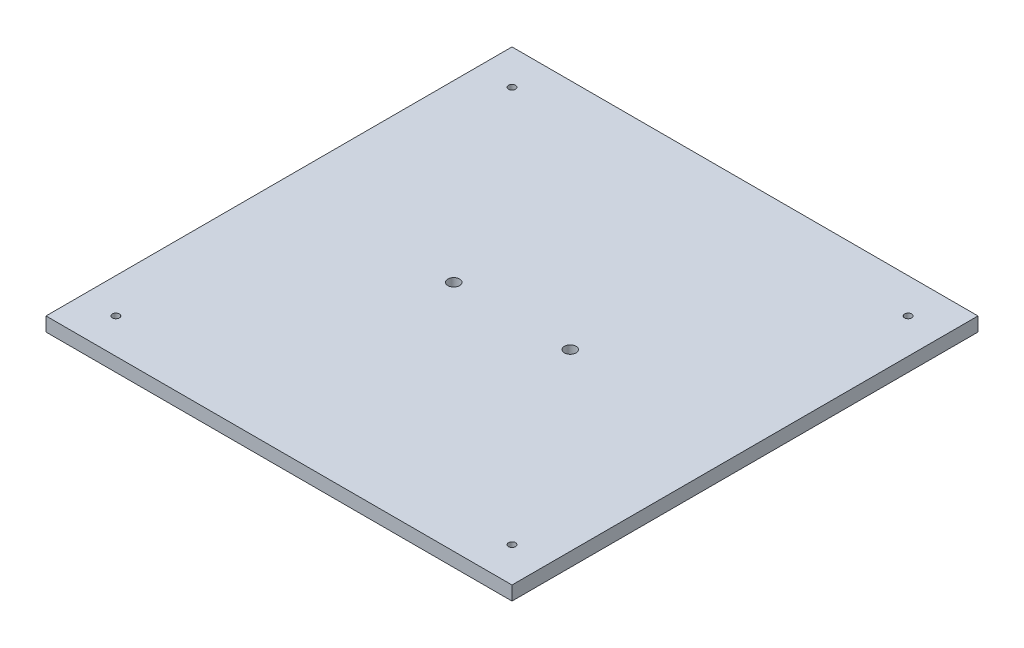
ISO-10303-21;
HEADER;
FILE_DESCRIPTION(('STEP AP214'),'2;1');
FILE_NAME('part.step','',(''),(''),'','','');
FILE_SCHEMA(('AUTOMOTIVE_DESIGN { 1 0 10303 214 1 1 1 1 }'));
ENDSEC;
DATA;
#1=APPLICATION_CONTEXT('core data for automotive mechanical design processes');
#2=APPLICATION_PROTOCOL_DEFINITION('international standard','automotive_design',2000,#1);
#3=PRODUCT_CONTEXT('',#1,'mechanical');
#4=PRODUCT('Part','Part','',(#3));
#5=PRODUCT_RELATED_PRODUCT_CATEGORY('part','',(#4));
#6=PRODUCT_DEFINITION_FORMATION('','',#4);
#7=PRODUCT_DEFINITION_CONTEXT('part definition',#1,'design');
#8=PRODUCT_DEFINITION('design','',#6,#7);
#9=PRODUCT_DEFINITION_SHAPE('','',#8);
#10=(LENGTH_UNIT() NAMED_UNIT(*) SI_UNIT(.MILLI.,.METRE.));
#11=(NAMED_UNIT(*) PLANE_ANGLE_UNIT() SI_UNIT($,.RADIAN.));
#12=(NAMED_UNIT(*) SI_UNIT($,.STERADIAN.) SOLID_ANGLE_UNIT());
#13=UNCERTAINTY_MEASURE_WITH_UNIT(LENGTH_MEASURE(1.E-05),#10,'distance_accuracy_value','');
#14=(GEOMETRIC_REPRESENTATION_CONTEXT(3) GLOBAL_UNCERTAINTY_ASSIGNED_CONTEXT((#13)) GLOBAL_UNIT_ASSIGNED_CONTEXT((#10,
#11,#12)) REPRESENTATION_CONTEXT('',''));
#15=CARTESIAN_POINT('',(0.,0.,0.));
#16=DIRECTION('',(0.,0.,1.));
#17=DIRECTION('',(1.,0.,0.));
#18=AXIS2_PLACEMENT_3D('',#15,#16,#17);
#19=CARTESIAN_POINT('',(0.,12.,0.));
#20=DIRECTION('',(0.,1.,0.));
#21=DIRECTION('',(0.,0.,1.));
#22=AXIS2_PLACEMENT_3D('',#19,#20,#21);
#23=PLANE('',#22);
#24=CARTESIAN_POINT('',(170.00000000001,12.,169.99999999999));
#25=DIRECTION('',(0.,1.,0.));
#26=DIRECTION('',(0.,0.,1.));
#27=AXIS2_PLACEMENT_3D('',#24,#25,#26);
#28=CIRCLE('',#27,2.99999999999999);
#29=CARTESIAN_POINT('',(170.00000000001,12.,172.99999999999));
#30=VERTEX_POINT('',#29);
#31=EDGE_CURVE('E133',#30,#30,#28,.T.);
#32=ORIENTED_EDGE('',*,*,#31,.F.);
#33=EDGE_LOOP('',(#32));
#34=FACE_BOUND('',#33,.T.);
#35=CARTESIAN_POINT('',(50.0000000000048,12.,-4.77395900588817E-12));
#36=DIRECTION('',(0.,1.,0.));
#37=DIRECTION('',(0.,0.,1.));
#38=AXIS2_PLACEMENT_3D('',#35,#36,#37);
#39=CIRCLE('',#38,5.);
#40=CARTESIAN_POINT('',(50.0000000000048,12.,4.99999999999522));
#41=VERTEX_POINT('',#40);
#42=EDGE_CURVE('E121',#41,#41,#39,.T.);
#43=ORIENTED_EDGE('',*,*,#42,.F.);
#44=EDGE_LOOP('',(#43));
#45=FACE_BOUND('',#44,.T.);
#46=CARTESIAN_POINT('',(-49.9999999999952,12.,-4.77395900588817E-12));
#47=DIRECTION('',(0.,1.,0.));
#48=DIRECTION('',(0.,0.,1.));
#49=AXIS2_PLACEMENT_3D('',#46,#47,#48);
#50=CIRCLE('',#49,5.);
#51=CARTESIAN_POINT('',(-49.9999999999952,12.,4.99999999999522));
#52=VERTEX_POINT('',#51);
#53=EDGE_CURVE('E100',#52,#52,#50,.T.);
#54=ORIENTED_EDGE('',*,*,#53,.F.);
#55=EDGE_LOOP('',(#54));
#56=FACE_BOUND('',#55,.T.);
#57=DIRECTION('',(0.,0.,1.));
#58=VECTOR('',#57,1.);
#59=CARTESIAN_POINT('',(-200.,12.,-200.));
#60=LINE('',#59,#58);
#61=CARTESIAN_POINT('',(-200.,12.,-200.));
#62=VERTEX_POINT('',#61);
#63=CARTESIAN_POINT('',(-200.,12.,200.));
#64=VERTEX_POINT('',#63);
#65=EDGE_CURVE('E85',#62,#64,#60,.T.);
#66=ORIENTED_EDGE('',*,*,#65,.T.);
#67=DIRECTION('',(1.,0.,0.));
#68=VECTOR('',#67,1.);
#69=CARTESIAN_POINT('',(-200.,12.,200.));
#70=LINE('',#69,#68);
#71=CARTESIAN_POINT('',(200.,12.,200.));
#72=VERTEX_POINT('',#71);
#73=EDGE_CURVE('E80',#64,#72,#70,.T.);
#74=ORIENTED_EDGE('',*,*,#73,.T.);
#75=DIRECTION('',(0.,0.,-1.));
#76=VECTOR('',#75,1.);
#77=CARTESIAN_POINT('',(200.,12.,-200.));
#78=LINE('',#77,#76);
#79=CARTESIAN_POINT('',(200.,12.,-200.));
#80=VERTEX_POINT('',#79);
#81=EDGE_CURVE('E83',#72,#80,#78,.T.);
#82=ORIENTED_EDGE('',*,*,#81,.T.);
#83=DIRECTION('',(-1.,0.,0.));
#84=VECTOR('',#83,1.);
#85=CARTESIAN_POINT('',(-200.,12.,-200.));
#86=LINE('',#85,#84);
#87=EDGE_CURVE('E50',#80,#62,#86,.T.);
#88=ORIENTED_EDGE('',*,*,#87,.T.);
#89=EDGE_LOOP('',(#66,#74,#82,#88));
#90=FACE_BOUND('',#89,.T.);
#91=CARTESIAN_POINT('',(-170.,12.,-170.));
#92=DIRECTION('',(0.,1.,0.));
#93=DIRECTION('',(0.,0.,1.));
#94=AXIS2_PLACEMENT_3D('',#91,#92,#93);
#95=CIRCLE('',#94,2.99999999999999);
#96=CARTESIAN_POINT('',(-170.,12.,-167.));
#97=VERTEX_POINT('',#96);
#98=EDGE_CURVE('E115',#97,#97,#95,.T.);
#99=ORIENTED_EDGE('',*,*,#98,.F.);
#100=EDGE_LOOP('',(#99));
#101=FACE_BOUND('',#100,.T.);
#102=CARTESIAN_POINT('',(170.,12.,-170.00000000001));
#103=DIRECTION('',(0.,1.,0.));
#104=DIRECTION('',(0.,0.,1.));
#105=AXIS2_PLACEMENT_3D('',#102,#103,#104);
#106=CIRCLE('',#105,2.99999999999999);
#107=CARTESIAN_POINT('',(170.,12.,-167.00000000001));
#108=VERTEX_POINT('',#107);
#109=EDGE_CURVE('E127',#108,#108,#106,.T.);
#110=ORIENTED_EDGE('',*,*,#109,.F.);
#111=EDGE_LOOP('',(#110));
#112=FACE_BOUND('',#111,.T.);
#113=CARTESIAN_POINT('',(-169.99999999999,12.,170.));
#114=DIRECTION('',(0.,1.,0.));
#115=DIRECTION('',(0.,0.,1.));
#116=AXIS2_PLACEMENT_3D('',#113,#114,#115);
#117=CIRCLE('',#116,2.99999999999999);
#118=CARTESIAN_POINT('',(-169.99999999999,12.,173.));
#119=VERTEX_POINT('',#118);
#120=EDGE_CURVE('E139',#119,#119,#117,.T.);
#121=ORIENTED_EDGE('',*,*,#120,.F.);
#122=EDGE_LOOP('',(#121));
#123=FACE_BOUND('',#122,.T.);
#124=ADVANCED_FACE('F33',(#34,#45,#56,#90,#101,#112,#123),#23,.T.);
#125=CARTESIAN_POINT('',(0.,0.,0.));
#126=DIRECTION('',(0.,1.,0.));
#127=DIRECTION('',(0.,0.,1.));
#128=AXIS2_PLACEMENT_3D('',#125,#126,#127);
#129=PLANE('',#128);
#130=DIRECTION('',(0.,0.,1.));
#131=VECTOR('',#130,1.);
#132=CARTESIAN_POINT('',(-200.,0.,-200.));
#133=LINE('',#132,#131);
#134=CARTESIAN_POINT('',(-200.,0.,-200.));
#135=VERTEX_POINT('',#134);
#136=CARTESIAN_POINT('',(-200.,0.,200.));
#137=VERTEX_POINT('',#136);
#138=EDGE_CURVE('E97',#135,#137,#133,.T.);
#139=ORIENTED_EDGE('',*,*,#138,.F.);
#140=DIRECTION('',(-1.,0.,0.));
#141=VECTOR('',#140,1.);
#142=CARTESIAN_POINT('',(-200.,0.,-200.));
#143=LINE('',#142,#141);
#144=CARTESIAN_POINT('',(200.,0.,-200.));
#145=VERTEX_POINT('',#144);
#146=EDGE_CURVE('E73',#145,#135,#143,.T.);
#147=ORIENTED_EDGE('',*,*,#146,.F.);
#148=DIRECTION('',(0.,0.,-1.));
#149=VECTOR('',#148,1.);
#150=CARTESIAN_POINT('',(200.,0.,-200.));
#151=LINE('',#150,#149);
#152=CARTESIAN_POINT('',(200.,0.,200.));
#153=VERTEX_POINT('',#152);
#154=EDGE_CURVE('E67',#153,#145,#151,.T.);
#155=ORIENTED_EDGE('',*,*,#154,.F.);
#156=DIRECTION('',(1.,0.,0.));
#157=VECTOR('',#156,1.);
#158=CARTESIAN_POINT('',(-200.,0.,200.));
#159=LINE('',#158,#157);
#160=EDGE_CURVE('E89',#137,#153,#159,.T.);
#161=ORIENTED_EDGE('',*,*,#160,.F.);
#162=EDGE_LOOP('',(#139,#147,#155,#161));
#163=FACE_BOUND('',#162,.T.);
#164=CARTESIAN_POINT('',(-49.9999999999952,0.,-4.77395900588817E-12));
#165=DIRECTION('',(0.,1.,0.));
#166=DIRECTION('',(0.,0.,1.));
#167=AXIS2_PLACEMENT_3D('',#164,#165,#166);
#168=CIRCLE('',#167,5.);
#169=CARTESIAN_POINT('',(-49.9999999999952,0.,4.99999999999522));
#170=VERTEX_POINT('',#169);
#171=EDGE_CURVE('E112',#170,#170,#168,.T.);
#172=ORIENTED_EDGE('',*,*,#171,.T.);
#173=EDGE_LOOP('',(#172));
#174=FACE_BOUND('',#173,.T.);
#175=CARTESIAN_POINT('',(-170.,0.,-170.));
#176=DIRECTION('',(0.,1.,0.));
#177=DIRECTION('',(0.,0.,1.));
#178=AXIS2_PLACEMENT_3D('',#175,#176,#177);
#179=CIRCLE('',#178,2.99999999999999);
#180=CARTESIAN_POINT('',(-170.,0.,-167.));
#181=VERTEX_POINT('',#180);
#182=EDGE_CURVE('E118',#181,#181,#179,.T.);
#183=ORIENTED_EDGE('',*,*,#182,.T.);
#184=EDGE_LOOP('',(#183));
#185=FACE_BOUND('',#184,.T.);
#186=CARTESIAN_POINT('',(50.0000000000048,0.,-4.77395900588817E-12));
#187=DIRECTION('',(0.,1.,0.));
#188=DIRECTION('',(0.,0.,1.));
#189=AXIS2_PLACEMENT_3D('',#186,#187,#188);
#190=CIRCLE('',#189,5.);
#191=CARTESIAN_POINT('',(50.0000000000048,0.,4.99999999999522));
#192=VERTEX_POINT('',#191);
#193=EDGE_CURVE('E124',#192,#192,#190,.T.);
#194=ORIENTED_EDGE('',*,*,#193,.T.);
#195=EDGE_LOOP('',(#194));
#196=FACE_BOUND('',#195,.T.);
#197=CARTESIAN_POINT('',(170.,0.,-170.00000000001));
#198=DIRECTION('',(0.,1.,0.));
#199=DIRECTION('',(0.,0.,1.));
#200=AXIS2_PLACEMENT_3D('',#197,#198,#199);
#201=CIRCLE('',#200,2.99999999999999);
#202=CARTESIAN_POINT('',(170.,0.,-167.00000000001));
#203=VERTEX_POINT('',#202);
#204=EDGE_CURVE('E130',#203,#203,#201,.T.);
#205=ORIENTED_EDGE('',*,*,#204,.T.);
#206=EDGE_LOOP('',(#205));
#207=FACE_BOUND('',#206,.T.);
#208=CARTESIAN_POINT('',(170.00000000001,0.,169.99999999999));
#209=DIRECTION('',(0.,1.,0.));
#210=DIRECTION('',(0.,0.,1.));
#211=AXIS2_PLACEMENT_3D('',#208,#209,#210);
#212=CIRCLE('',#211,2.99999999999999);
#213=CARTESIAN_POINT('',(170.00000000001,0.,172.99999999999));
#214=VERTEX_POINT('',#213);
#215=EDGE_CURVE('E136',#214,#214,#212,.T.);
#216=ORIENTED_EDGE('',*,*,#215,.T.);
#217=EDGE_LOOP('',(#216));
#218=FACE_BOUND('',#217,.T.);
#219=CARTESIAN_POINT('',(-169.99999999999,0.,170.));
#220=DIRECTION('',(0.,1.,0.));
#221=DIRECTION('',(0.,0.,1.));
#222=AXIS2_PLACEMENT_3D('',#219,#220,#221);
#223=CIRCLE('',#222,2.99999999999999);
#224=CARTESIAN_POINT('',(-169.99999999999,0.,173.));
#225=VERTEX_POINT('',#224);
#226=EDGE_CURVE('E142',#225,#225,#223,.T.);
#227=ORIENTED_EDGE('',*,*,#226,.T.);
#228=EDGE_LOOP('',(#227));
#229=FACE_BOUND('',#228,.T.);
#230=ADVANCED_FACE('F108',(#163,#174,#185,#196,#207,#218,#229),#129,.F.);
#231=CARTESIAN_POINT('',(-200.,12.,-200.));
#232=DIRECTION('',(1.,0.,0.));
#233=DIRECTION('',(0.,0.,-1.));
#234=AXIS2_PLACEMENT_3D('',#231,#232,#233);
#235=PLANE('',#234);
#236=ORIENTED_EDGE('',*,*,#138,.T.);
#237=DIRECTION('',(0.,-1.,0.));
#238=VECTOR('',#237,1.);
#239=CARTESIAN_POINT('',(-200.,12.,200.));
#240=LINE('',#239,#238);
#241=EDGE_CURVE('E11',#64,#137,#240,.T.);
#242=ORIENTED_EDGE('',*,*,#241,.F.);
#243=ORIENTED_EDGE('',*,*,#65,.F.);
#244=DIRECTION('',(0.,-1.,0.));
#245=VECTOR('',#244,1.);
#246=CARTESIAN_POINT('',(-200.,12.,-200.));
#247=LINE('',#246,#245);
#248=EDGE_CURVE('E93',#62,#135,#247,.T.);
#249=ORIENTED_EDGE('',*,*,#248,.T.);
#250=EDGE_LOOP('',(#236,#242,#243,#249));
#251=FACE_BOUND('',#250,.T.);
#252=ADVANCED_FACE('F35',(#251),#235,.F.);
#253=CARTESIAN_POINT('',(-200.,12.,200.));
#254=DIRECTION('',(0.,0.,-1.));
#255=DIRECTION('',(-1.,0.,0.));
#256=AXIS2_PLACEMENT_3D('',#253,#254,#255);
#257=PLANE('',#256);
#258=ORIENTED_EDGE('',*,*,#160,.T.);
#259=DIRECTION('',(0.,-1.,0.));
#260=VECTOR('',#259,1.);
#261=CARTESIAN_POINT('',(200.,12.,200.));
#262=LINE('',#261,#260);
#263=EDGE_CURVE('E42',#72,#153,#262,.T.);
#264=ORIENTED_EDGE('',*,*,#263,.F.);
#265=ORIENTED_EDGE('',*,*,#73,.F.);
#266=ORIENTED_EDGE('',*,*,#241,.T.);
#267=EDGE_LOOP('',(#258,#264,#265,#266));
#268=FACE_BOUND('',#267,.T.);
#269=ADVANCED_FACE('F88',(#268),#257,.F.);
#270=CARTESIAN_POINT('',(200.,12.,-200.));
#271=DIRECTION('',(-1.,0.,0.));
#272=DIRECTION('',(0.,0.,1.));
#273=AXIS2_PLACEMENT_3D('',#270,#271,#272);
#274=PLANE('',#273);
#275=ORIENTED_EDGE('',*,*,#154,.T.);
#276=DIRECTION('',(0.,-1.,0.));
#277=VECTOR('',#276,1.);
#278=CARTESIAN_POINT('',(200.,12.,-200.));
#279=LINE('',#278,#277);
#280=EDGE_CURVE('E90',#80,#145,#279,.T.);
#281=ORIENTED_EDGE('',*,*,#280,.F.);
#282=ORIENTED_EDGE('',*,*,#81,.F.);
#283=ORIENTED_EDGE('',*,*,#263,.T.);
#284=EDGE_LOOP('',(#275,#281,#282,#283));
#285=FACE_BOUND('',#284,.T.);
#286=ADVANCED_FACE('F91',(#285),#274,.F.);
#287=CARTESIAN_POINT('',(-200.,12.,-200.));
#288=DIRECTION('',(0.,0.,1.));
#289=DIRECTION('',(1.,0.,0.));
#290=AXIS2_PLACEMENT_3D('',#287,#288,#289);
#291=PLANE('',#290);
#292=ORIENTED_EDGE('',*,*,#146,.T.);
#293=ORIENTED_EDGE('',*,*,#248,.F.);
#294=ORIENTED_EDGE('',*,*,#87,.F.);
#295=ORIENTED_EDGE('',*,*,#280,.T.);
#296=EDGE_LOOP('',(#292,#293,#294,#295));
#297=FACE_BOUND('',#296,.T.);
#298=ADVANCED_FACE('F105',(#297),#291,.F.);
#299=CARTESIAN_POINT('',(-49.9999999999952,12.,-4.77395900588817E-12));
#300=DIRECTION('',(0.,-1.,0.));
#301=DIRECTION('',(0.,0.,-1.));
#302=AXIS2_PLACEMENT_3D('',#299,#300,#301);
#303=CYLINDRICAL_SURFACE('',#302,5.);
#304=ORIENTED_EDGE('',*,*,#53,.T.);
#305=EDGE_LOOP('',(#304));
#306=FACE_BOUND('',#305,.T.);
#307=ORIENTED_EDGE('',*,*,#171,.F.);
#308=EDGE_LOOP('',(#307));
#309=FACE_BOUND('',#308,.T.);
#310=ADVANCED_FACE('F161',(#306,#309),#303,.F.);
#311=CARTESIAN_POINT('',(-170.,12.,-170.));
#312=DIRECTION('',(0.,-1.,0.));
#313=DIRECTION('',(0.,0.,-1.));
#314=AXIS2_PLACEMENT_3D('',#311,#312,#313);
#315=CYLINDRICAL_SURFACE('',#314,2.99999999999999);
#316=ORIENTED_EDGE('',*,*,#98,.T.);
#317=EDGE_LOOP('',(#316));
#318=FACE_BOUND('',#317,.T.);
#319=ORIENTED_EDGE('',*,*,#182,.F.);
#320=EDGE_LOOP('',(#319));
#321=FACE_BOUND('',#320,.T.);
#322=ADVANCED_FACE('F207',(#318,#321),#315,.F.);
#323=CARTESIAN_POINT('',(50.0000000000048,12.,-4.77395900588817E-12));
#324=DIRECTION('',(0.,-1.,0.));
#325=DIRECTION('',(0.,0.,-1.));
#326=AXIS2_PLACEMENT_3D('',#323,#324,#325);
#327=CYLINDRICAL_SURFACE('',#326,5.);
#328=ORIENTED_EDGE('',*,*,#42,.T.);
#329=EDGE_LOOP('',(#328));
#330=FACE_BOUND('',#329,.T.);
#331=ORIENTED_EDGE('',*,*,#193,.F.);
#332=EDGE_LOOP('',(#331));
#333=FACE_BOUND('',#332,.T.);
#334=ADVANCED_FACE('F215',(#330,#333),#327,.F.);
#335=CARTESIAN_POINT('',(170.,12.,-170.00000000001));
#336=DIRECTION('',(0.,-1.,0.));
#337=DIRECTION('',(0.,0.,-1.));
#338=AXIS2_PLACEMENT_3D('',#335,#336,#337);
#339=CYLINDRICAL_SURFACE('',#338,2.99999999999999);
#340=ORIENTED_EDGE('',*,*,#109,.T.);
#341=EDGE_LOOP('',(#340));
#342=FACE_BOUND('',#341,.T.);
#343=ORIENTED_EDGE('',*,*,#204,.F.);
#344=EDGE_LOOP('',(#343));
#345=FACE_BOUND('',#344,.T.);
#346=ADVANCED_FACE('F223',(#342,#345),#339,.F.);
#347=CARTESIAN_POINT('',(170.00000000001,12.,169.99999999999));
#348=DIRECTION('',(0.,-1.,0.));
#349=DIRECTION('',(0.,0.,-1.));
#350=AXIS2_PLACEMENT_3D('',#347,#348,#349);
#351=CYLINDRICAL_SURFACE('',#350,2.99999999999999);
#352=ORIENTED_EDGE('',*,*,#31,.T.);
#353=EDGE_LOOP('',(#352));
#354=FACE_BOUND('',#353,.T.);
#355=ORIENTED_EDGE('',*,*,#215,.F.);
#356=EDGE_LOOP('',(#355));
#357=FACE_BOUND('',#356,.T.);
#358=ADVANCED_FACE('F232',(#354,#357),#351,.F.);
#359=CARTESIAN_POINT('',(-169.99999999999,12.,170.));
#360=DIRECTION('',(0.,-1.,0.));
#361=DIRECTION('',(0.,0.,-1.));
#362=AXIS2_PLACEMENT_3D('',#359,#360,#361);
#363=CYLINDRICAL_SURFACE('',#362,2.99999999999999);
#364=ORIENTED_EDGE('',*,*,#120,.T.);
#365=EDGE_LOOP('',(#364));
#366=FACE_BOUND('',#365,.T.);
#367=ORIENTED_EDGE('',*,*,#226,.F.);
#368=EDGE_LOOP('',(#367));
#369=FACE_BOUND('',#368,.T.);
#370=ADVANCED_FACE('F148',(#366,#369),#363,.F.);
#371=CLOSED_SHELL('',(#124,#230,#252,#269,#286,#298,#310,#322,#334,#346,#358,#370));
#372=MANIFOLD_SOLID_BREP('B2',#371);
#373=ADVANCED_BREP_SHAPE_REPRESENTATION('',(#18,#372),#14);
#374=SHAPE_DEFINITION_REPRESENTATION(#9,#373);
ENDSEC;
END-ISO-10303-21;
